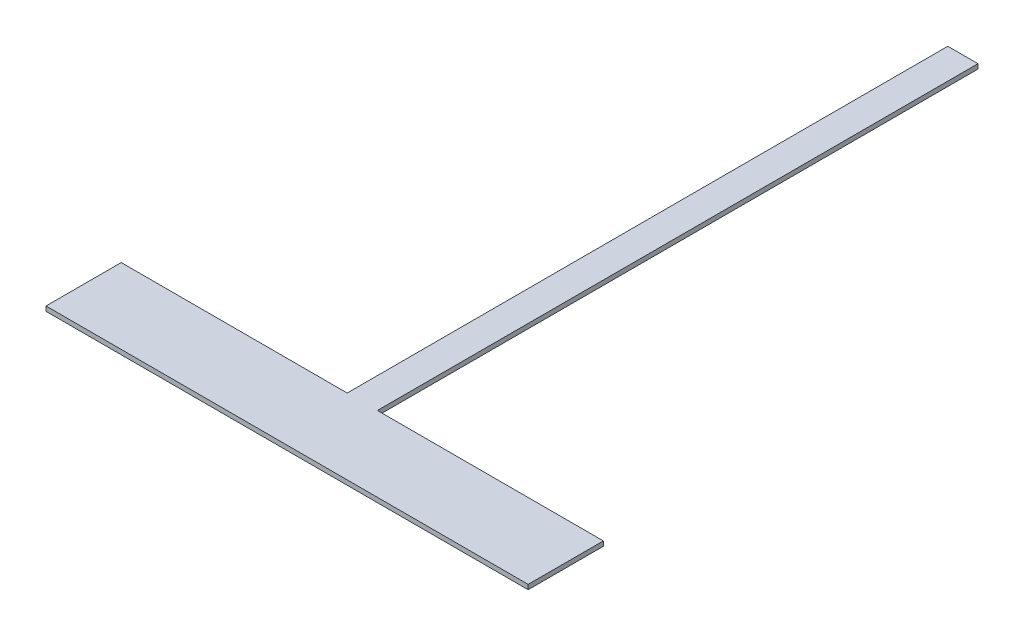
ISO-10303-21;
HEADER;
FILE_DESCRIPTION(('STEP AP214'),'2;1');
FILE_NAME('part.step','',(''),(''),'','','');
FILE_SCHEMA(('AUTOMOTIVE_DESIGN { 1 0 10303 214 1 1 1 1 }'));
ENDSEC;
DATA;
#1=APPLICATION_CONTEXT('core data for automotive mechanical design processes');
#2=APPLICATION_PROTOCOL_DEFINITION('international standard','automotive_design',2000,#1);
#3=PRODUCT_CONTEXT('',#1,'mechanical');
#4=PRODUCT('Part','Part','',(#3));
#5=PRODUCT_RELATED_PRODUCT_CATEGORY('part','',(#4));
#6=PRODUCT_DEFINITION_FORMATION('','',#4);
#7=PRODUCT_DEFINITION_CONTEXT('part definition',#1,'design');
#8=PRODUCT_DEFINITION('design','',#6,#7);
#9=PRODUCT_DEFINITION_SHAPE('','',#8);
#10=(LENGTH_UNIT() NAMED_UNIT(*) SI_UNIT(.MILLI.,.METRE.));
#11=(NAMED_UNIT(*) PLANE_ANGLE_UNIT() SI_UNIT($,.RADIAN.));
#12=(NAMED_UNIT(*) SI_UNIT($,.STERADIAN.) SOLID_ANGLE_UNIT());
#13=UNCERTAINTY_MEASURE_WITH_UNIT(LENGTH_MEASURE(1.E-05),#10,'distance_accuracy_value','');
#14=(GEOMETRIC_REPRESENTATION_CONTEXT(3) GLOBAL_UNCERTAINTY_ASSIGNED_CONTEXT((#13)) GLOBAL_UNIT_ASSIGNED_CONTEXT((#10,
#11,#12)) REPRESENTATION_CONTEXT('',''));
#15=CARTESIAN_POINT('',(0.,0.,0.));
#16=DIRECTION('',(0.,0.,1.));
#17=DIRECTION('',(1.,0.,0.));
#18=AXIS2_PLACEMENT_3D('',#15,#16,#17);
#19=CARTESIAN_POINT('',(-81.08,1.57,0.));
#20=DIRECTION('',(0.,0.,1.));
#21=DIRECTION('',(-1.,0.,0.));
#22=AXIS2_PLACEMENT_3D('',#19,#20,#21);
#23=PLANE('',#22);
#24=DIRECTION('',(1.,0.,0.));
#25=VECTOR('',#24,1.);
#26=CARTESIAN_POINT('',(-81.08,0.,0.));
#27=LINE('',#26,#25);
#28=CARTESIAN_POINT('',(-81.08,0.,0.));
#29=VERTEX_POINT('',#28);
#30=CARTESIAN_POINT('',(-5.08000000000002,0.,0.));
#31=VERTEX_POINT('',#30);
#32=EDGE_CURVE('E137',#29,#31,#27,.T.);
#33=ORIENTED_EDGE('',*,*,#32,.F.);
#34=DIRECTION('',(0.,-1.,0.));
#35=VECTOR('',#34,1.);
#36=CARTESIAN_POINT('',(-81.08,1.57,0.));
#37=LINE('',#36,#35);
#38=CARTESIAN_POINT('',(-81.08,1.57,0.));
#39=VERTEX_POINT('',#38);
#40=EDGE_CURVE('E136',#39,#29,#37,.T.);
#41=ORIENTED_EDGE('',*,*,#40,.F.);
#42=DIRECTION('',(1.,0.,0.));
#43=VECTOR('',#42,1.);
#44=CARTESIAN_POINT('',(-81.08,1.57,0.));
#45=LINE('',#44,#43);
#46=CARTESIAN_POINT('',(-5.08000000000002,1.57,0.));
#47=VERTEX_POINT('',#46);
#48=EDGE_CURVE('E155',#39,#47,#45,.T.);
#49=ORIENTED_EDGE('',*,*,#48,.T.);
#50=DIRECTION('',(0.,-1.,0.));
#51=VECTOR('',#50,1.);
#52=CARTESIAN_POINT('',(-5.08000000000002,1.57,0.));
#53=LINE('',#52,#51);
#54=EDGE_CURVE('E11',#47,#31,#53,.T.);
#55=ORIENTED_EDGE('',*,*,#54,.T.);
#56=EDGE_LOOP('',(#33,#41,#49,#55));
#57=FACE_BOUND('',#56,.T.);
#58=ADVANCED_FACE('F41',(#57),#23,.F.);
#59=CARTESIAN_POINT('',(-5.08000000000002,1.57,0.));
#60=DIRECTION('',(1.,0.,0.));
#61=DIRECTION('',(0.,0.,1.));
#62=AXIS2_PLACEMENT_3D('',#59,#60,#61);
#63=PLANE('',#62);
#64=DIRECTION('',(0.,0.,-1.));
#65=VECTOR('',#64,1.);
#66=CARTESIAN_POINT('',(-5.08000000000002,0.,0.));
#67=LINE('',#66,#65);
#68=CARTESIAN_POINT('',(-5.08,0.,-202.));
#69=VERTEX_POINT('',#68);
#70=EDGE_CURVE('E139',#31,#69,#67,.T.);
#71=ORIENTED_EDGE('',*,*,#70,.F.);
#72=ORIENTED_EDGE('',*,*,#54,.F.);
#73=DIRECTION('',(0.,0.,-1.));
#74=VECTOR('',#73,1.);
#75=CARTESIAN_POINT('',(-5.08000000000002,1.57,0.));
#76=LINE('',#75,#74);
#77=CARTESIAN_POINT('',(-5.08,1.57,-202.));
#78=VERTEX_POINT('',#77);
#79=EDGE_CURVE('E95',#47,#78,#76,.T.);
#80=ORIENTED_EDGE('',*,*,#79,.T.);
#81=DIRECTION('',(0.,-1.,0.));
#82=VECTOR('',#81,1.);
#83=CARTESIAN_POINT('',(-5.08,1.57,-202.));
#84=LINE('',#83,#82);
#85=EDGE_CURVE('E49',#78,#69,#84,.T.);
#86=ORIENTED_EDGE('',*,*,#85,.T.);
#87=EDGE_LOOP('',(#71,#72,#80,#86));
#88=FACE_BOUND('',#87,.T.);
#89=ADVANCED_FACE('F167',(#88),#63,.F.);
#90=CARTESIAN_POINT('',(-5.08,1.57,-202.));
#91=DIRECTION('',(0.,0.,1.));
#92=DIRECTION('',(-1.,0.,0.));
#93=AXIS2_PLACEMENT_3D('',#90,#91,#92);
#94=PLANE('',#93);
#95=DIRECTION('',(1.,0.,0.));
#96=VECTOR('',#95,1.);
#97=CARTESIAN_POINT('',(-5.08,0.,-202.));
#98=LINE('',#97,#96);
#99=CARTESIAN_POINT('',(5.08,0.,-202.));
#100=VERTEX_POINT('',#99);
#101=EDGE_CURVE('E142',#69,#100,#98,.T.);
#102=ORIENTED_EDGE('',*,*,#101,.F.);
#103=ORIENTED_EDGE('',*,*,#85,.F.);
#104=DIRECTION('',(1.,0.,0.));
#105=VECTOR('',#104,1.);
#106=CARTESIAN_POINT('',(-5.08,1.57,-202.));
#107=LINE('',#106,#105);
#108=CARTESIAN_POINT('',(5.08,1.57,-202.));
#109=VERTEX_POINT('',#108);
#110=EDGE_CURVE('E176',#78,#109,#107,.T.);
#111=ORIENTED_EDGE('',*,*,#110,.T.);
#112=DIRECTION('',(0.,-1.,0.));
#113=VECTOR('',#112,1.);
#114=CARTESIAN_POINT('',(5.08,1.57,-202.));
#115=LINE('',#114,#113);
#116=EDGE_CURVE('E162',#109,#100,#115,.T.);
#117=ORIENTED_EDGE('',*,*,#116,.T.);
#118=EDGE_LOOP('',(#102,#103,#111,#117));
#119=FACE_BOUND('',#118,.T.);
#120=ADVANCED_FACE('F186',(#119),#94,.F.);
#121=CARTESIAN_POINT('',(5.08,1.57,-202.));
#122=DIRECTION('',(-1.,0.,0.));
#123=DIRECTION('',(0.,0.,-1.));
#124=AXIS2_PLACEMENT_3D('',#121,#122,#123);
#125=PLANE('',#124);
#126=DIRECTION('',(0.,0.,1.));
#127=VECTOR('',#126,1.);
#128=CARTESIAN_POINT('',(5.08,0.,-202.));
#129=LINE('',#128,#127);
#130=CARTESIAN_POINT('',(5.08000000000002,0.,0.));
#131=VERTEX_POINT('',#130);
#132=EDGE_CURVE('E145',#100,#131,#129,.T.);
#133=ORIENTED_EDGE('',*,*,#132,.F.);
#134=ORIENTED_EDGE('',*,*,#116,.F.);
#135=DIRECTION('',(0.,0.,1.));
#136=VECTOR('',#135,1.);
#137=CARTESIAN_POINT('',(5.08,1.57,-202.));
#138=LINE('',#137,#136);
#139=CARTESIAN_POINT('',(5.08000000000002,1.57,0.));
#140=VERTEX_POINT('',#139);
#141=EDGE_CURVE('E131',#109,#140,#138,.T.);
#142=ORIENTED_EDGE('',*,*,#141,.T.);
#143=DIRECTION('',(0.,-1.,0.));
#144=VECTOR('',#143,1.);
#145=CARTESIAN_POINT('',(5.08000000000002,1.57,0.));
#146=LINE('',#145,#144);
#147=EDGE_CURVE('E159',#140,#131,#146,.T.);
#148=ORIENTED_EDGE('',*,*,#147,.T.);
#149=EDGE_LOOP('',(#133,#134,#142,#148));
#150=FACE_BOUND('',#149,.T.);
#151=ADVANCED_FACE('F182',(#150),#125,.F.);
#152=CARTESIAN_POINT('',(5.08000000000002,1.57,0.));
#153=DIRECTION('',(0.,0.,1.));
#154=DIRECTION('',(-1.,0.,0.));
#155=AXIS2_PLACEMENT_3D('',#152,#153,#154);
#156=PLANE('',#155);
#157=DIRECTION('',(1.,0.,0.));
#158=VECTOR('',#157,1.);
#159=CARTESIAN_POINT('',(5.08000000000002,0.,0.));
#160=LINE('',#159,#158);
#161=CARTESIAN_POINT('',(81.08,0.,0.));
#162=VERTEX_POINT('',#161);
#163=EDGE_CURVE('E148',#131,#162,#160,.T.);
#164=ORIENTED_EDGE('',*,*,#163,.F.);
#165=ORIENTED_EDGE('',*,*,#147,.F.);
#166=DIRECTION('',(1.,0.,0.));
#167=VECTOR('',#166,1.);
#168=CARTESIAN_POINT('',(5.08000000000002,1.57,0.));
#169=LINE('',#168,#167);
#170=CARTESIAN_POINT('',(81.08,1.57,0.));
#171=VERTEX_POINT('',#170);
#172=EDGE_CURVE('E129',#140,#171,#169,.T.);
#173=ORIENTED_EDGE('',*,*,#172,.T.);
#174=DIRECTION('',(0.,-1.,0.));
#175=VECTOR('',#174,1.);
#176=CARTESIAN_POINT('',(81.08,1.57,0.));
#177=LINE('',#176,#175);
#178=EDGE_CURVE('E123',#171,#162,#177,.T.);
#179=ORIENTED_EDGE('',*,*,#178,.T.);
#180=EDGE_LOOP('',(#164,#165,#173,#179));
#181=FACE_BOUND('',#180,.T.);
#182=ADVANCED_FACE('F185',(#181),#156,.F.);
#183=CARTESIAN_POINT('',(81.08,1.57,0.));
#184=DIRECTION('',(-1.,0.,0.));
#185=DIRECTION('',(0.,0.,-1.));
#186=AXIS2_PLACEMENT_3D('',#183,#184,#185);
#187=PLANE('',#186);
#188=DIRECTION('',(0.,0.,1.));
#189=VECTOR('',#188,1.);
#190=CARTESIAN_POINT('',(81.08,0.,0.));
#191=LINE('',#190,#189);
#192=CARTESIAN_POINT('',(81.08,0.,25.3));
#193=VERTEX_POINT('',#192);
#194=EDGE_CURVE('E151',#162,#193,#191,.T.);
#195=ORIENTED_EDGE('',*,*,#194,.F.);
#196=ORIENTED_EDGE('',*,*,#178,.F.);
#197=DIRECTION('',(0.,0.,1.));
#198=VECTOR('',#197,1.);
#199=CARTESIAN_POINT('',(81.08,1.57,0.));
#200=LINE('',#199,#198);
#201=CARTESIAN_POINT('',(81.08,1.57,25.3));
#202=VERTEX_POINT('',#201);
#203=EDGE_CURVE('E113',#171,#202,#200,.T.);
#204=ORIENTED_EDGE('',*,*,#203,.T.);
#205=DIRECTION('',(0.,-1.,0.));
#206=VECTOR('',#205,1.);
#207=CARTESIAN_POINT('',(81.08,1.57,25.3));
#208=LINE('',#207,#206);
#209=EDGE_CURVE('E118',#202,#193,#208,.T.);
#210=ORIENTED_EDGE('',*,*,#209,.T.);
#211=EDGE_LOOP('',(#195,#196,#204,#210));
#212=FACE_BOUND('',#211,.T.);
#213=ADVANCED_FACE('F126',(#212),#187,.F.);
#214=CARTESIAN_POINT('',(81.08,1.57,25.3));
#215=DIRECTION('',(0.,0.,-1.));
#216=DIRECTION('',(1.,0.,0.));
#217=AXIS2_PLACEMENT_3D('',#214,#215,#216);
#218=PLANE('',#217);
#219=DIRECTION('',(-1.,0.,0.));
#220=VECTOR('',#219,1.);
#221=CARTESIAN_POINT('',(81.08,0.,25.3));
#222=LINE('',#221,#220);
#223=CARTESIAN_POINT('',(-81.08,0.,25.3));
#224=VERTEX_POINT('',#223);
#225=EDGE_CURVE('E120',#193,#224,#222,.T.);
#226=ORIENTED_EDGE('',*,*,#225,.F.);
#227=ORIENTED_EDGE('',*,*,#209,.F.);
#228=DIRECTION('',(-1.,0.,0.));
#229=VECTOR('',#228,1.);
#230=CARTESIAN_POINT('',(81.08,1.57,25.3));
#231=LINE('',#230,#229);
#232=CARTESIAN_POINT('',(-81.08,1.57,25.3));
#233=VERTEX_POINT('',#232);
#234=EDGE_CURVE('E109',#202,#233,#231,.T.);
#235=ORIENTED_EDGE('',*,*,#234,.T.);
#236=DIRECTION('',(0.,-1.,0.));
#237=VECTOR('',#236,1.);
#238=CARTESIAN_POINT('',(-81.08,1.57,25.3));
#239=LINE('',#238,#237);
#240=EDGE_CURVE('E124',#233,#224,#239,.T.);
#241=ORIENTED_EDGE('',*,*,#240,.T.);
#242=EDGE_LOOP('',(#226,#227,#235,#241));
#243=FACE_BOUND('',#242,.T.);
#244=ADVANCED_FACE('F119',(#243),#218,.F.);
#245=CARTESIAN_POINT('',(-81.08,1.57,25.3));
#246=DIRECTION('',(1.,0.,0.));
#247=DIRECTION('',(0.,0.,1.));
#248=AXIS2_PLACEMENT_3D('',#245,#246,#247);
#249=PLANE('',#248);
#250=DIRECTION('',(0.,0.,-1.));
#251=VECTOR('',#250,1.);
#252=CARTESIAN_POINT('',(-81.08,0.,25.3));
#253=LINE('',#252,#251);
#254=EDGE_CURVE('E83',#224,#29,#253,.T.);
#255=ORIENTED_EDGE('',*,*,#254,.F.);
#256=ORIENTED_EDGE('',*,*,#240,.F.);
#257=DIRECTION('',(0.,0.,-1.));
#258=VECTOR('',#257,1.);
#259=CARTESIAN_POINT('',(-81.08,1.57,25.3));
#260=LINE('',#259,#258);
#261=EDGE_CURVE('E57',#233,#39,#260,.T.);
#262=ORIENTED_EDGE('',*,*,#261,.T.);
#263=ORIENTED_EDGE('',*,*,#40,.T.);
#264=EDGE_LOOP('',(#255,#256,#262,#263));
#265=FACE_BOUND('',#264,.T.);
#266=ADVANCED_FACE('F238',(#265),#249,.F.);
#267=CARTESIAN_POINT('',(0.,1.57,0.));
#268=DIRECTION('',(0.,-1.,0.));
#269=DIRECTION('',(0.,0.,1.));
#270=AXIS2_PLACEMENT_3D('',#267,#268,#269);
#271=PLANE('',#270);
#272=ORIENTED_EDGE('',*,*,#48,.F.);
#273=ORIENTED_EDGE('',*,*,#261,.F.);
#274=ORIENTED_EDGE('',*,*,#234,.F.);
#275=ORIENTED_EDGE('',*,*,#203,.F.);
#276=ORIENTED_EDGE('',*,*,#172,.F.);
#277=ORIENTED_EDGE('',*,*,#141,.F.);
#278=ORIENTED_EDGE('',*,*,#110,.F.);
#279=ORIENTED_EDGE('',*,*,#79,.F.);
#280=EDGE_LOOP('',(#272,#273,#274,#275,#276,#277,#278,#279));
#281=FACE_BOUND('',#280,.T.);
#282=ADVANCED_FACE('F111',(#281),#271,.F.);
#283=CARTESIAN_POINT('',(0.,0.,0.));
#284=DIRECTION('',(0.,-1.,0.));
#285=DIRECTION('',(0.,0.,1.));
#286=AXIS2_PLACEMENT_3D('',#283,#284,#285);
#287=PLANE('',#286);
#288=ORIENTED_EDGE('',*,*,#32,.T.);
#289=ORIENTED_EDGE('',*,*,#70,.T.);
#290=ORIENTED_EDGE('',*,*,#101,.T.);
#291=ORIENTED_EDGE('',*,*,#132,.T.);
#292=ORIENTED_EDGE('',*,*,#163,.T.);
#293=ORIENTED_EDGE('',*,*,#194,.T.);
#294=ORIENTED_EDGE('',*,*,#225,.T.);
#295=ORIENTED_EDGE('',*,*,#254,.T.);
#296=EDGE_LOOP('',(#288,#289,#290,#291,#292,#293,#294,#295));
#297=FACE_BOUND('',#296,.T.);
#298=ADVANCED_FACE('F170',(#297),#287,.T.);
#299=CLOSED_SHELL('',(#58,#89,#120,#151,#182,#213,#244,#266,#282,#298));
#300=MANIFOLD_SOLID_BREP('B2',#299);
#301=ADVANCED_BREP_SHAPE_REPRESENTATION('',(#18,#300),#14);
#302=SHAPE_DEFINITION_REPRESENTATION(#9,#301);
ENDSEC;
END-ISO-10303-21;
